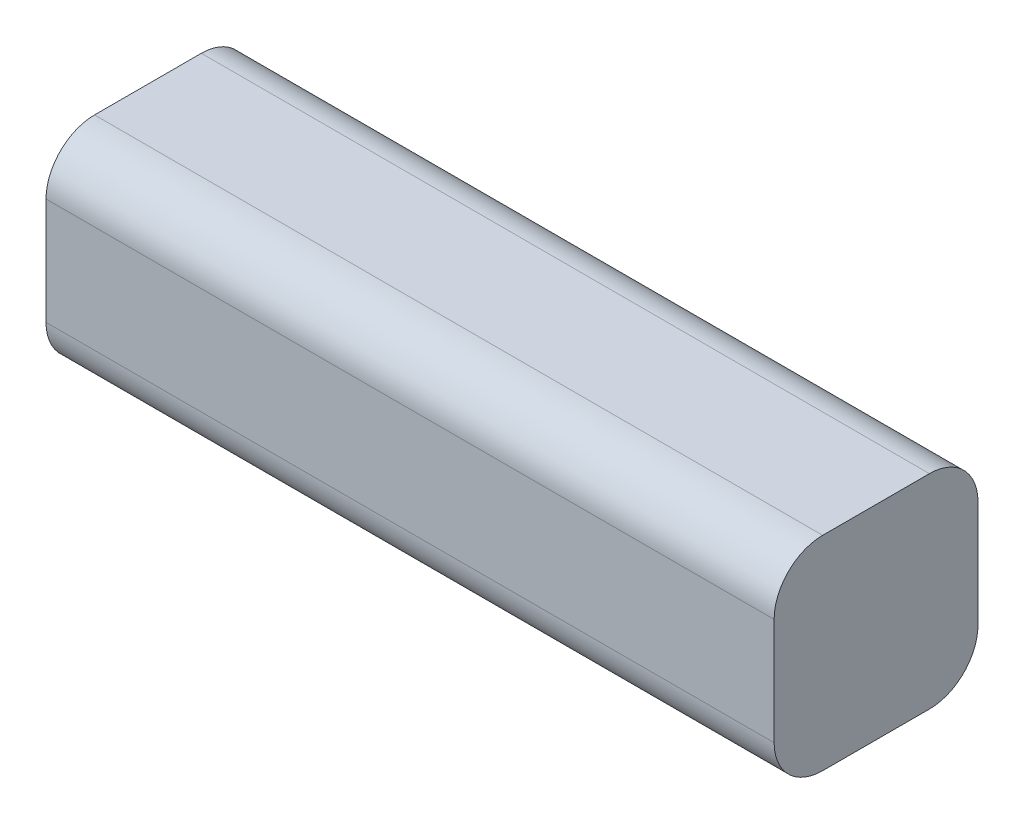
ISO-10303-21;
HEADER;
FILE_DESCRIPTION(('STEP AP214'),'2;1');
FILE_NAME('part.step','',(''),(''),'','','');
FILE_SCHEMA(('AUTOMOTIVE_DESIGN { 1 0 10303 214 1 1 1 1 }'));
ENDSEC;
DATA;
#1=APPLICATION_CONTEXT('core data for automotive mechanical design processes');
#2=APPLICATION_PROTOCOL_DEFINITION('international standard','automotive_design',2000,#1);
#3=PRODUCT_CONTEXT('',#1,'mechanical');
#4=PRODUCT('Part','Part','',(#3));
#5=PRODUCT_RELATED_PRODUCT_CATEGORY('part','',(#4));
#6=PRODUCT_DEFINITION_FORMATION('','',#4);
#7=PRODUCT_DEFINITION_CONTEXT('part definition',#1,'design');
#8=PRODUCT_DEFINITION('design','',#6,#7);
#9=PRODUCT_DEFINITION_SHAPE('','',#8);
#10=(LENGTH_UNIT() NAMED_UNIT(*) SI_UNIT(.MILLI.,.METRE.));
#11=(NAMED_UNIT(*) PLANE_ANGLE_UNIT() SI_UNIT($,.RADIAN.));
#12=(NAMED_UNIT(*) SI_UNIT($,.STERADIAN.) SOLID_ANGLE_UNIT());
#13=UNCERTAINTY_MEASURE_WITH_UNIT(LENGTH_MEASURE(1.E-05),#10,'distance_accuracy_value','');
#14=(GEOMETRIC_REPRESENTATION_CONTEXT(3) GLOBAL_UNCERTAINTY_ASSIGNED_CONTEXT((#13)) GLOBAL_UNIT_ASSIGNED_CONTEXT((#10,
#11,#12)) REPRESENTATION_CONTEXT('',''));
#15=CARTESIAN_POINT('',(0.,0.,0.));
#16=DIRECTION('',(0.,0.,1.));
#17=DIRECTION('',(1.,0.,0.));
#18=AXIS2_PLACEMENT_3D('',#15,#16,#17);
#19=CARTESIAN_POINT('',(0.,42.,-42.));
#20=DIRECTION('',(1.,0.,0.));
#21=DIRECTION('',(0.,0.,-1.));
#22=AXIS2_PLACEMENT_3D('',#19,#20,#21);
#23=PLANE('',#22);
#24=DIRECTION('',(0.,-1.,0.));
#25=VECTOR('',#24,1.);
#26=CARTESIAN_POINT('',(0.,42.,0.));
#27=LINE('',#26,#25);
#28=CARTESIAN_POINT('',(0.,32.,0.));
#29=VERTEX_POINT('',#28);
#30=CARTESIAN_POINT('',(0.,10.,0.));
#31=VERTEX_POINT('',#30);
#32=EDGE_CURVE('E114',#29,#31,#27,.T.);
#33=ORIENTED_EDGE('',*,*,#32,.F.);
#34=CARTESIAN_POINT('',(0.,32.,-10.));
#35=DIRECTION('',(1.,0.,0.));
#36=DIRECTION('',(0.,0.,-1.));
#37=AXIS2_PLACEMENT_3D('',#34,#35,#36);
#38=CIRCLE('',#37,10.);
#39=CARTESIAN_POINT('',(0.,42.,-10.));
#40=VERTEX_POINT('',#39);
#41=EDGE_CURVE('E118',#29,#40,#38,.F.);
#42=ORIENTED_EDGE('',*,*,#41,.T.);
#43=DIRECTION('',(0.,0.,1.));
#44=VECTOR('',#43,1.);
#45=CARTESIAN_POINT('',(0.,42.,-42.));
#46=LINE('',#45,#44);
#47=CARTESIAN_POINT('',(0.,42.,-32.));
#48=VERTEX_POINT('',#47);
#49=EDGE_CURVE('E109',#48,#40,#46,.T.);
#50=ORIENTED_EDGE('',*,*,#49,.F.);
#51=CARTESIAN_POINT('',(0.,32.,-32.));
#52=DIRECTION('',(1.,0.,0.));
#53=DIRECTION('',(0.,0.,-1.));
#54=AXIS2_PLACEMENT_3D('',#51,#52,#53);
#55=CIRCLE('',#54,10.);
#56=CARTESIAN_POINT('',(0.,32.,-42.));
#57=VERTEX_POINT('',#56);
#58=EDGE_CURVE('E55',#48,#57,#55,.F.);
#59=ORIENTED_EDGE('',*,*,#58,.T.);
#60=DIRECTION('',(0.,-1.,0.));
#61=VECTOR('',#60,1.);
#62=CARTESIAN_POINT('',(0.,42.,-42.));
#63=LINE('',#62,#61);
#64=CARTESIAN_POINT('',(0.,10.,-42.));
#65=VERTEX_POINT('',#64);
#66=EDGE_CURVE('E121',#57,#65,#63,.T.);
#67=ORIENTED_EDGE('',*,*,#66,.T.);
#68=CARTESIAN_POINT('',(0.,10.,-32.));
#69=DIRECTION('',(1.,0.,0.));
#70=DIRECTION('',(0.,0.,-1.));
#71=AXIS2_PLACEMENT_3D('',#68,#69,#70);
#72=CIRCLE('',#71,10.);
#73=CARTESIAN_POINT('',(0.,0.,-32.));
#74=VERTEX_POINT('',#73);
#75=EDGE_CURVE('E48',#65,#74,#72,.F.);
#76=ORIENTED_EDGE('',*,*,#75,.T.);
#77=DIRECTION('',(0.,0.,1.));
#78=VECTOR('',#77,1.);
#79=CARTESIAN_POINT('',(0.,0.,-42.));
#80=LINE('',#79,#78);
#81=CARTESIAN_POINT('',(0.,0.,-10.));
#82=VERTEX_POINT('',#81);
#83=EDGE_CURVE('E124',#74,#82,#80,.T.);
#84=ORIENTED_EDGE('',*,*,#83,.T.);
#85=CARTESIAN_POINT('',(0.,10.,-10.));
#86=DIRECTION('',(1.,0.,0.));
#87=DIRECTION('',(0.,0.,-1.));
#88=AXIS2_PLACEMENT_3D('',#85,#86,#87);
#89=CIRCLE('',#88,10.);
#90=EDGE_CURVE('E152',#82,#31,#89,.F.);
#91=ORIENTED_EDGE('',*,*,#90,.T.);
#92=EDGE_LOOP('',(#33,#42,#50,#59,#67,#76,#84,#91));
#93=FACE_BOUND('',#92,.T.);
#94=ADVANCED_FACE('F33',(#93),#23,.F.);
#95=CARTESIAN_POINT('',(0.,42.,0.));
#96=DIRECTION('',(0.,0.,-1.));
#97=DIRECTION('',(-1.,0.,0.));
#98=AXIS2_PLACEMENT_3D('',#95,#96,#97);
#99=PLANE('',#98);
#100=DIRECTION('',(0.,-1.,0.));
#101=VECTOR('',#100,1.);
#102=CARTESIAN_POINT('',(150.,42.,0.));
#103=LINE('',#102,#101);
#104=CARTESIAN_POINT('',(150.,32.,0.));
#105=VERTEX_POINT('',#104);
#106=CARTESIAN_POINT('',(150.,10.,0.));
#107=VERTEX_POINT('',#106);
#108=EDGE_CURVE('E133',#105,#107,#103,.T.);
#109=ORIENTED_EDGE('',*,*,#108,.F.);
#110=DIRECTION('',(1.,0.,0.));
#111=VECTOR('',#110,1.);
#112=CARTESIAN_POINT('',(0.,32.,0.));
#113=LINE('',#112,#111);
#114=EDGE_CURVE('E102',#105,#29,#113,.F.);
#115=ORIENTED_EDGE('',*,*,#114,.T.);
#116=ORIENTED_EDGE('',*,*,#32,.T.);
#117=DIRECTION('',(1.,0.,0.));
#118=VECTOR('',#117,1.);
#119=CARTESIAN_POINT('',(0.,10.,0.));
#120=LINE('',#119,#118);
#121=EDGE_CURVE('E147',#31,#107,#120,.T.);
#122=ORIENTED_EDGE('',*,*,#121,.T.);
#123=EDGE_LOOP('',(#109,#115,#116,#122));
#124=FACE_BOUND('',#123,.T.);
#125=ADVANCED_FACE('F176',(#124),#99,.F.);
#126=CARTESIAN_POINT('',(150.,42.,0.));
#127=DIRECTION('',(-1.,0.,0.));
#128=DIRECTION('',(0.,0.,1.));
#129=AXIS2_PLACEMENT_3D('',#126,#127,#128);
#130=PLANE('',#129);
#131=DIRECTION('',(0.,0.,-1.));
#132=VECTOR('',#131,1.);
#133=CARTESIAN_POINT('',(150.,42.,0.));
#134=LINE('',#133,#132);
#135=CARTESIAN_POINT('',(150.,42.,-10.));
#136=VERTEX_POINT('',#135);
#137=CARTESIAN_POINT('',(150.,42.,-32.));
#138=VERTEX_POINT('',#137);
#139=EDGE_CURVE('E112',#136,#138,#134,.T.);
#140=ORIENTED_EDGE('',*,*,#139,.F.);
#141=CARTESIAN_POINT('',(150.,32.,-10.));
#142=DIRECTION('',(-1.,0.,0.));
#143=DIRECTION('',(0.,0.,1.));
#144=AXIS2_PLACEMENT_3D('',#141,#142,#143);
#145=CIRCLE('',#144,10.);
#146=EDGE_CURVE('E145',#136,#105,#145,.F.);
#147=ORIENTED_EDGE('',*,*,#146,.T.);
#148=ORIENTED_EDGE('',*,*,#108,.T.);
#149=CARTESIAN_POINT('',(150.,10.,-10.));
#150=DIRECTION('',(-1.,0.,0.));
#151=DIRECTION('',(0.,0.,1.));
#152=AXIS2_PLACEMENT_3D('',#149,#150,#151);
#153=CIRCLE('',#152,10.);
#154=CARTESIAN_POINT('',(150.,0.,-10.));
#155=VERTEX_POINT('',#154);
#156=EDGE_CURVE('E143',#107,#155,#153,.F.);
#157=ORIENTED_EDGE('',*,*,#156,.T.);
#158=DIRECTION('',(0.,0.,-1.));
#159=VECTOR('',#158,1.);
#160=CARTESIAN_POINT('',(150.,0.,0.));
#161=LINE('',#160,#159);
#162=CARTESIAN_POINT('',(150.,0.,-32.));
#163=VERTEX_POINT('',#162);
#164=EDGE_CURVE('E119',#155,#163,#161,.T.);
#165=ORIENTED_EDGE('',*,*,#164,.T.);
#166=CARTESIAN_POINT('',(150.,10.,-32.));
#167=DIRECTION('',(-1.,0.,0.));
#168=DIRECTION('',(0.,0.,1.));
#169=AXIS2_PLACEMENT_3D('',#166,#167,#168);
#170=CIRCLE('',#169,10.);
#171=CARTESIAN_POINT('',(150.,10.,-42.));
#172=VERTEX_POINT('',#171);
#173=EDGE_CURVE('E141',#163,#172,#170,.F.);
#174=ORIENTED_EDGE('',*,*,#173,.T.);
#175=DIRECTION('',(0.,-1.,0.));
#176=VECTOR('',#175,1.);
#177=CARTESIAN_POINT('',(150.,42.,-42.));
#178=LINE('',#177,#176);
#179=CARTESIAN_POINT('',(150.,32.,-42.));
#180=VERTEX_POINT('',#179);
#181=EDGE_CURVE('E130',#180,#172,#178,.T.);
#182=ORIENTED_EDGE('',*,*,#181,.F.);
#183=CARTESIAN_POINT('',(150.,32.,-32.));
#184=DIRECTION('',(-1.,0.,0.));
#185=DIRECTION('',(0.,0.,1.));
#186=AXIS2_PLACEMENT_3D('',#183,#184,#185);
#187=CIRCLE('',#186,10.);
#188=EDGE_CURVE('E139',#180,#138,#187,.F.);
#189=ORIENTED_EDGE('',*,*,#188,.T.);
#190=EDGE_LOOP('',(#140,#147,#148,#157,#165,#174,#182,#189));
#191=FACE_BOUND('',#190,.T.);
#192=ADVANCED_FACE('F162',(#191),#130,.F.);
#193=CARTESIAN_POINT('',(150.,42.,-42.));
#194=DIRECTION('',(0.,0.,1.));
#195=DIRECTION('',(1.,0.,0.));
#196=AXIS2_PLACEMENT_3D('',#193,#194,#195);
#197=PLANE('',#196);
#198=ORIENTED_EDGE('',*,*,#181,.T.);
#199=DIRECTION('',(-1.,0.,0.));
#200=VECTOR('',#199,1.);
#201=CARTESIAN_POINT('',(150.,10.,-42.));
#202=LINE('',#201,#200);
#203=EDGE_CURVE('E11',#172,#65,#202,.T.);
#204=ORIENTED_EDGE('',*,*,#203,.T.);
#205=ORIENTED_EDGE('',*,*,#66,.F.);
#206=DIRECTION('',(-1.,0.,0.));
#207=VECTOR('',#206,1.);
#208=CARTESIAN_POINT('',(150.,32.,-42.));
#209=LINE('',#208,#207);
#210=EDGE_CURVE('E41',#57,#180,#209,.F.);
#211=ORIENTED_EDGE('',*,*,#210,.T.);
#212=EDGE_LOOP('',(#198,#204,#205,#211));
#213=FACE_BOUND('',#212,.T.);
#214=ADVANCED_FACE('F160',(#213),#197,.F.);
#215=CARTESIAN_POINT('',(0.,42.,0.));
#216=DIRECTION('',(0.,1.,0.));
#217=DIRECTION('',(0.,0.,1.));
#218=AXIS2_PLACEMENT_3D('',#215,#216,#217);
#219=PLANE('',#218);
#220=ORIENTED_EDGE('',*,*,#49,.T.);
#221=DIRECTION('',(1.,0.,0.));
#222=VECTOR('',#221,1.);
#223=CARTESIAN_POINT('',(150.,42.,-10.));
#224=LINE('',#223,#222);
#225=EDGE_CURVE('E113',#40,#136,#224,.T.);
#226=ORIENTED_EDGE('',*,*,#225,.T.);
#227=ORIENTED_EDGE('',*,*,#139,.T.);
#228=DIRECTION('',(-1.,0.,0.));
#229=VECTOR('',#228,1.);
#230=CARTESIAN_POINT('',(0.,42.,-32.));
#231=LINE('',#230,#229);
#232=EDGE_CURVE('E101',#138,#48,#231,.T.);
#233=ORIENTED_EDGE('',*,*,#232,.T.);
#234=EDGE_LOOP('',(#220,#226,#227,#233));
#235=FACE_BOUND('',#234,.T.);
#236=ADVANCED_FACE('F107',(#235),#219,.T.);
#237=CARTESIAN_POINT('',(0.,0.,0.));
#238=DIRECTION('',(0.,1.,0.));
#239=DIRECTION('',(0.,0.,1.));
#240=AXIS2_PLACEMENT_3D('',#237,#238,#239);
#241=PLANE('',#240);
#242=ORIENTED_EDGE('',*,*,#164,.F.);
#243=DIRECTION('',(1.,0.,0.));
#244=VECTOR('',#243,1.);
#245=CARTESIAN_POINT('',(0.,0.,-10.));
#246=LINE('',#245,#244);
#247=EDGE_CURVE('E157',#155,#82,#246,.F.);
#248=ORIENTED_EDGE('',*,*,#247,.T.);
#249=ORIENTED_EDGE('',*,*,#83,.F.);
#250=DIRECTION('',(-1.,0.,0.));
#251=VECTOR('',#250,1.);
#252=CARTESIAN_POINT('',(0.,0.,-32.));
#253=LINE('',#252,#251);
#254=EDGE_CURVE('E155',#74,#163,#253,.F.);
#255=ORIENTED_EDGE('',*,*,#254,.T.);
#256=EDGE_LOOP('',(#242,#248,#249,#255));
#257=FACE_BOUND('',#256,.T.);
#258=ADVANCED_FACE('F169',(#257),#241,.F.);
#259=CARTESIAN_POINT('',(0.,32.,-10.));
#260=DIRECTION('',(-1.,0.,0.));
#261=DIRECTION('',(0.,0.,1.));
#262=AXIS2_PLACEMENT_3D('',#259,#260,#261);
#263=CYLINDRICAL_SURFACE('',#262,10.);
#264=ORIENTED_EDGE('',*,*,#41,.F.);
#265=ORIENTED_EDGE('',*,*,#114,.F.);
#266=ORIENTED_EDGE('',*,*,#146,.F.);
#267=ORIENTED_EDGE('',*,*,#225,.F.);
#268=EDGE_LOOP('',(#264,#265,#266,#267));
#269=FACE_BOUND('',#268,.T.);
#270=ADVANCED_FACE('F179',(#269),#263,.T.);
#271=CARTESIAN_POINT('',(0.,10.,-10.));
#272=DIRECTION('',(1.,0.,0.));
#273=DIRECTION('',(0.,0.,-1.));
#274=AXIS2_PLACEMENT_3D('',#271,#272,#273);
#275=CYLINDRICAL_SURFACE('',#274,10.);
#276=ORIENTED_EDGE('',*,*,#90,.F.);
#277=ORIENTED_EDGE('',*,*,#247,.F.);
#278=ORIENTED_EDGE('',*,*,#156,.F.);
#279=ORIENTED_EDGE('',*,*,#121,.F.);
#280=EDGE_LOOP('',(#276,#277,#278,#279));
#281=FACE_BOUND('',#280,.T.);
#282=ADVANCED_FACE('F172',(#281),#275,.T.);
#283=CARTESIAN_POINT('',(150.,10.,-32.));
#284=DIRECTION('',(-1.,0.,0.));
#285=DIRECTION('',(0.,0.,1.));
#286=AXIS2_PLACEMENT_3D('',#283,#284,#285);
#287=CYLINDRICAL_SURFACE('',#286,10.);
#288=ORIENTED_EDGE('',*,*,#173,.F.);
#289=ORIENTED_EDGE('',*,*,#254,.F.);
#290=ORIENTED_EDGE('',*,*,#75,.F.);
#291=ORIENTED_EDGE('',*,*,#203,.F.);
#292=EDGE_LOOP('',(#288,#289,#290,#291));
#293=FACE_BOUND('',#292,.T.);
#294=ADVANCED_FACE('F165',(#293),#287,.T.);
#295=CARTESIAN_POINT('',(0.,32.,-32.));
#296=DIRECTION('',(1.,0.,0.));
#297=DIRECTION('',(0.,0.,-1.));
#298=AXIS2_PLACEMENT_3D('',#295,#296,#297);
#299=CYLINDRICAL_SURFACE('',#298,10.);
#300=ORIENTED_EDGE('',*,*,#188,.F.);
#301=ORIENTED_EDGE('',*,*,#210,.F.);
#302=ORIENTED_EDGE('',*,*,#58,.F.);
#303=ORIENTED_EDGE('',*,*,#232,.F.);
#304=EDGE_LOOP('',(#300,#301,#302,#303));
#305=FACE_BOUND('',#304,.T.);
#306=ADVANCED_FACE('F35',(#305),#299,.T.);
#307=CLOSED_SHELL('',(#94,#125,#192,#214,#236,#258,#270,#282,#294,#306));
#308=MANIFOLD_SOLID_BREP('B2',#307);
#309=ADVANCED_BREP_SHAPE_REPRESENTATION('',(#18,#308),#14);
#310=SHAPE_DEFINITION_REPRESENTATION(#9,#309);
ENDSEC;
END-ISO-10303-21;
